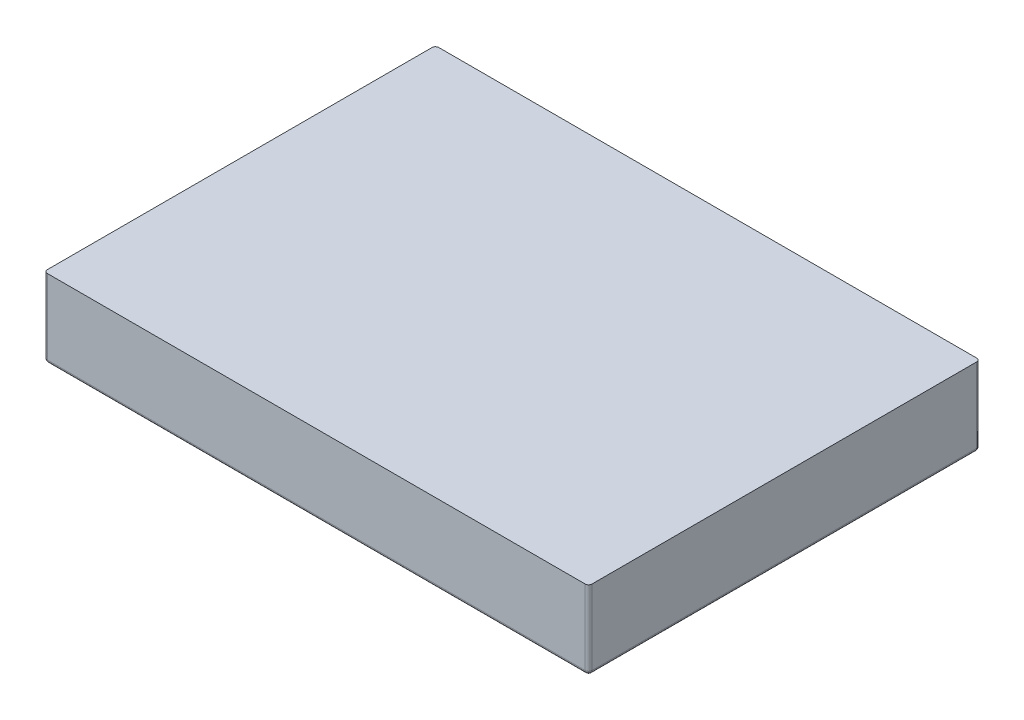
ISO-10303-21;
HEADER;
FILE_DESCRIPTION(('STEP AP214'),'2;1');
FILE_NAME('part.step','',(''),(''),'','','');
FILE_SCHEMA(('AUTOMOTIVE_DESIGN { 1 0 10303 214 1 1 1 1 }'));
ENDSEC;
DATA;
#1=APPLICATION_CONTEXT('core data for automotive mechanical design processes');
#2=APPLICATION_PROTOCOL_DEFINITION('international standard','automotive_design',2000,#1);
#3=PRODUCT_CONTEXT('',#1,'mechanical');
#4=PRODUCT('Part','Part','',(#3));
#5=PRODUCT_RELATED_PRODUCT_CATEGORY('part','',(#4));
#6=PRODUCT_DEFINITION_FORMATION('','',#4);
#7=PRODUCT_DEFINITION_CONTEXT('part definition',#1,'design');
#8=PRODUCT_DEFINITION('design','',#6,#7);
#9=PRODUCT_DEFINITION_SHAPE('','',#8);
#10=(LENGTH_UNIT() NAMED_UNIT(*) SI_UNIT(.MILLI.,.METRE.));
#11=(NAMED_UNIT(*) PLANE_ANGLE_UNIT() SI_UNIT($,.RADIAN.));
#12=(NAMED_UNIT(*) SI_UNIT($,.STERADIAN.) SOLID_ANGLE_UNIT());
#13=UNCERTAINTY_MEASURE_WITH_UNIT(LENGTH_MEASURE(1.E-05),#10,'distance_accuracy_value','');
#14=(GEOMETRIC_REPRESENTATION_CONTEXT(3) GLOBAL_UNCERTAINTY_ASSIGNED_CONTEXT((#13)) GLOBAL_UNIT_ASSIGNED_CONTEXT((#10,
#11,#12)) REPRESENTATION_CONTEXT('',''));
#15=CARTESIAN_POINT('',(0.,0.,0.));
#16=DIRECTION('',(0.,0.,1.));
#17=DIRECTION('',(1.,0.,0.));
#18=AXIS2_PLACEMENT_3D('',#15,#16,#17);
#19=CARTESIAN_POINT('',(-1.6,-0.46,-1.15));
#20=DIRECTION('',(0.,-1.,0.));
#21=DIRECTION('',(0.,0.,-1.));
#22=AXIS2_PLACEMENT_3D('',#19,#20,#21);
#23=PLANE('',#22);
#24=DIRECTION('',(0.,0.,1.));
#25=VECTOR('',#24,1.);
#26=CARTESIAN_POINT('',(1.58,-0.46,-1.15));
#27=LINE('',#26,#25);
#28=CARTESIAN_POINT('',(1.58,-0.46,1.13));
#29=VERTEX_POINT('',#28);
#30=CARTESIAN_POINT('',(1.58,-0.46,-1.13000000000014));
#31=VERTEX_POINT('',#30);
#32=EDGE_CURVE('E106',#29,#31,#27,.F.);
#33=ORIENTED_EDGE('',*,*,#32,.F.);
#34=DIRECTION('',(-1.,0.,0.));
#35=VECTOR('',#34,1.);
#36=CARTESIAN_POINT('',(-1.6,-0.46,1.13));
#37=LINE('',#36,#35);
#38=CARTESIAN_POINT('',(-1.58,-0.46,1.1300000000001));
#39=VERTEX_POINT('',#38);
#40=EDGE_CURVE('E101',#39,#29,#37,.F.);
#41=ORIENTED_EDGE('',*,*,#40,.F.);
#42=DIRECTION('',(0.,0.,-1.));
#43=VECTOR('',#42,1.);
#44=CARTESIAN_POINT('',(-1.58,-0.46,-1.15));
#45=LINE('',#44,#43);
#46=CARTESIAN_POINT('',(-1.58,-0.46,-1.13));
#47=VERTEX_POINT('',#46);
#48=EDGE_CURVE('E104',#47,#39,#45,.F.);
#49=ORIENTED_EDGE('',*,*,#48,.F.);
#50=DIRECTION('',(1.,0.,0.));
#51=VECTOR('',#50,1.);
#52=CARTESIAN_POINT('',(-1.6,-0.46,-1.13));
#53=LINE('',#52,#51);
#54=EDGE_CURVE('E168',#31,#47,#53,.F.);
#55=ORIENTED_EDGE('',*,*,#54,.F.);
#56=EDGE_LOOP('',(#33,#41,#49,#55));
#57=FACE_BOUND('',#56,.T.);
#58=ADVANCED_FACE('F17',(#57),#23,.T.);
#59=CARTESIAN_POINT('',(1.58,-0.44,1.13));
#60=DIRECTION('',(1.,0.,0.));
#61=DIRECTION('',(0.,1.,0.));
#62=AXIS2_PLACEMENT_3D('',#59,#60,#61);
#63=SPHERICAL_SURFACE('',#62,0.02);
#64=CARTESIAN_POINT('',(1.58,-0.44,1.13));
#65=DIRECTION('',(-1.,0.,0.));
#66=DIRECTION('',(0.,0.,1.));
#67=AXIS2_PLACEMENT_3D('',#64,#65,#66);
#68=CIRCLE('',#67,0.02);
#69=CARTESIAN_POINT('',(1.58,-0.44,1.15));
#70=VERTEX_POINT('',#69);
#71=EDGE_CURVE('E109',#29,#70,#68,.T.);
#72=ORIENTED_EDGE('',*,*,#71,.F.);
#73=CARTESIAN_POINT('',(1.58,-0.44,1.13));
#74=DIRECTION('',(0.,0.,1.));
#75=DIRECTION('',(1.,0.,0.));
#76=AXIS2_PLACEMENT_3D('',#73,#74,#75);
#77=CIRCLE('',#76,0.02);
#78=CARTESIAN_POINT('',(1.6,-0.44,1.13));
#79=VERTEX_POINT('',#78);
#80=EDGE_CURVE('E165',#79,#29,#77,.F.);
#81=ORIENTED_EDGE('',*,*,#80,.F.);
#82=CARTESIAN_POINT('',(1.58,-0.44,1.13));
#83=DIRECTION('',(0.,-1.,0.));
#84=DIRECTION('',(0.,0.,-1.));
#85=AXIS2_PLACEMENT_3D('',#82,#83,#84);
#86=CIRCLE('',#85,0.02);
#87=EDGE_CURVE('E231',#70,#79,#86,.F.);
#88=ORIENTED_EDGE('',*,*,#87,.F.);
#89=EDGE_LOOP('',(#72,#81,#88));
#90=FACE_BOUND('',#89,.T.);
#91=ADVANCED_FACE('F155',(#90),#63,.T.);
#92=CARTESIAN_POINT('',(-1.6,-0.44,1.13));
#93=DIRECTION('',(-1.,0.,0.));
#94=DIRECTION('',(0.,0.,1.));
#95=AXIS2_PLACEMENT_3D('',#92,#93,#94);
#96=CYLINDRICAL_SURFACE('',#95,0.02);
#97=ORIENTED_EDGE('',*,*,#71,.T.);
#98=DIRECTION('',(-1.,0.,0.));
#99=VECTOR('',#98,1.);
#100=CARTESIAN_POINT('',(1.6,-0.44,1.15));
#101=LINE('',#100,#99);
#102=CARTESIAN_POINT('',(-1.58,-0.44,1.15));
#103=VERTEX_POINT('',#102);
#104=EDGE_CURVE('E115',#70,#103,#101,.T.);
#105=ORIENTED_EDGE('',*,*,#104,.T.);
#106=CARTESIAN_POINT('',(-1.58,-0.44,1.13));
#107=DIRECTION('',(1.,0.,0.));
#108=DIRECTION('',(0.,1.,0.));
#109=AXIS2_PLACEMENT_3D('',#106,#107,#108);
#110=CIRCLE('',#109,0.02);
#111=EDGE_CURVE('E112',#39,#103,#110,.F.);
#112=ORIENTED_EDGE('',*,*,#111,.F.);
#113=ORIENTED_EDGE('',*,*,#40,.T.);
#114=EDGE_LOOP('',(#97,#105,#112,#113));
#115=FACE_BOUND('',#114,.T.);
#116=ADVANCED_FACE('F113',(#115),#96,.T.);
#117=CARTESIAN_POINT('',(-1.58,-0.44,1.13));
#118=DIRECTION('',(1.,0.,0.));
#119=DIRECTION('',(0.,1.,0.));
#120=AXIS2_PLACEMENT_3D('',#117,#118,#119);
#121=SPHERICAL_SURFACE('',#120,0.02);
#122=CARTESIAN_POINT('',(-1.58,-0.44,1.13));
#123=DIRECTION('',(0.,-1.,0.));
#124=DIRECTION('',(0.,0.,-1.));
#125=AXIS2_PLACEMENT_3D('',#122,#123,#124);
#126=CIRCLE('',#125,0.02);
#127=CARTESIAN_POINT('',(-1.6,-0.44,1.13));
#128=VERTEX_POINT('',#127);
#129=EDGE_CURVE('E130',#128,#103,#126,.F.);
#130=ORIENTED_EDGE('',*,*,#129,.F.);
#131=CARTESIAN_POINT('',(-1.58,-0.44,1.13));
#132=DIRECTION('',(0.,0.,-1.));
#133=DIRECTION('',(-1.,0.,0.));
#134=AXIS2_PLACEMENT_3D('',#131,#132,#133);
#135=CIRCLE('',#134,0.02);
#136=EDGE_CURVE('E121',#39,#128,#135,.T.);
#137=ORIENTED_EDGE('',*,*,#136,.F.);
#138=ORIENTED_EDGE('',*,*,#111,.T.);
#139=EDGE_LOOP('',(#130,#137,#138));
#140=FACE_BOUND('',#139,.T.);
#141=ADVANCED_FACE('F129',(#140),#121,.T.);
#142=CARTESIAN_POINT('',(-1.58,-0.44,-1.15));
#143=DIRECTION('',(0.,0.,-1.));
#144=DIRECTION('',(-1.,0.,0.));
#145=AXIS2_PLACEMENT_3D('',#142,#143,#144);
#146=CYLINDRICAL_SURFACE('',#145,0.02);
#147=CARTESIAN_POINT('',(-1.58,-0.44,-1.13));
#148=DIRECTION('',(0.,0.,-1.));
#149=DIRECTION('',(1.,0.,0.));
#150=AXIS2_PLACEMENT_3D('',#147,#148,#149);
#151=CIRCLE('',#150,0.02);
#152=CARTESIAN_POINT('',(-1.6,-0.44,-1.13));
#153=VERTEX_POINT('',#152);
#154=EDGE_CURVE('E126',#47,#153,#151,.T.);
#155=ORIENTED_EDGE('',*,*,#154,.F.);
#156=ORIENTED_EDGE('',*,*,#48,.T.);
#157=ORIENTED_EDGE('',*,*,#136,.T.);
#158=DIRECTION('',(0.,0.,-1.));
#159=VECTOR('',#158,1.);
#160=CARTESIAN_POINT('',(-1.6,-0.44,1.15));
#161=LINE('',#160,#159);
#162=EDGE_CURVE('E223',#128,#153,#161,.T.);
#163=ORIENTED_EDGE('',*,*,#162,.T.);
#164=EDGE_LOOP('',(#155,#156,#157,#163));
#165=FACE_BOUND('',#164,.T.);
#166=ADVANCED_FACE('F124',(#165),#146,.T.);
#167=CARTESIAN_POINT('',(-1.58,-0.44,-1.13));
#168=DIRECTION('',(1.,0.,0.));
#169=DIRECTION('',(0.,1.,0.));
#170=AXIS2_PLACEMENT_3D('',#167,#168,#169);
#171=SPHERICAL_SURFACE('',#170,0.02);
#172=CARTESIAN_POINT('',(-1.58,-0.44,-1.13));
#173=DIRECTION('',(0.,-1.,0.));
#174=DIRECTION('',(0.,0.,-1.));
#175=AXIS2_PLACEMENT_3D('',#172,#173,#174);
#176=CIRCLE('',#175,0.02);
#177=CARTESIAN_POINT('',(-1.58,-0.44,-1.15));
#178=VERTEX_POINT('',#177);
#179=EDGE_CURVE('E218',#178,#153,#176,.F.);
#180=ORIENTED_EDGE('',*,*,#179,.F.);
#181=CARTESIAN_POINT('',(-1.58,-0.44,-1.13));
#182=DIRECTION('',(1.,0.,0.));
#183=DIRECTION('',(0.,0.,-1.));
#184=AXIS2_PLACEMENT_3D('',#181,#182,#183);
#185=CIRCLE('',#184,0.02);
#186=EDGE_CURVE('E171',#47,#178,#185,.T.);
#187=ORIENTED_EDGE('',*,*,#186,.F.);
#188=ORIENTED_EDGE('',*,*,#154,.T.);
#189=EDGE_LOOP('',(#180,#187,#188));
#190=FACE_BOUND('',#189,.T.);
#191=ADVANCED_FACE('F267',(#190),#171,.T.);
#192=CARTESIAN_POINT('',(-1.6,-0.44,-1.13));
#193=DIRECTION('',(1.,0.,0.));
#194=DIRECTION('',(0.,0.,-1.));
#195=AXIS2_PLACEMENT_3D('',#192,#193,#194);
#196=CYLINDRICAL_SURFACE('',#195,0.02);
#197=CARTESIAN_POINT('',(1.58,-0.44,-1.13));
#198=DIRECTION('',(1.,0.,0.));
#199=DIRECTION('',(0.,1.,0.));
#200=AXIS2_PLACEMENT_3D('',#197,#198,#199);
#201=CIRCLE('',#200,0.02);
#202=CARTESIAN_POINT('',(1.58,-0.44,-1.15));
#203=VERTEX_POINT('',#202);
#204=EDGE_CURVE('E170',#31,#203,#201,.T.);
#205=ORIENTED_EDGE('',*,*,#204,.F.);
#206=ORIENTED_EDGE('',*,*,#54,.T.);
#207=ORIENTED_EDGE('',*,*,#186,.T.);
#208=DIRECTION('',(1.,0.,0.));
#209=VECTOR('',#208,1.);
#210=CARTESIAN_POINT('',(-1.6,-0.44,-1.15));
#211=LINE('',#210,#209);
#212=EDGE_CURVE('E213',#178,#203,#211,.T.);
#213=ORIENTED_EDGE('',*,*,#212,.T.);
#214=EDGE_LOOP('',(#205,#206,#207,#213));
#215=FACE_BOUND('',#214,.T.);
#216=ADVANCED_FACE('F263',(#215),#196,.T.);
#217=CARTESIAN_POINT('',(1.58,-0.44,-1.13));
#218=DIRECTION('',(1.,0.,0.));
#219=DIRECTION('',(0.,1.,0.));
#220=AXIS2_PLACEMENT_3D('',#217,#218,#219);
#221=SPHERICAL_SURFACE('',#220,0.02);
#222=ORIENTED_EDGE('',*,*,#204,.T.);
#223=CARTESIAN_POINT('',(1.58,-0.44,-1.13));
#224=DIRECTION('',(0.,-1.,0.));
#225=DIRECTION('',(0.,0.,-1.));
#226=AXIS2_PLACEMENT_3D('',#223,#224,#225);
#227=CIRCLE('',#226,0.02);
#228=CARTESIAN_POINT('',(1.6,-0.44,-1.13));
#229=VERTEX_POINT('',#228);
#230=EDGE_CURVE('E207',#229,#203,#227,.F.);
#231=ORIENTED_EDGE('',*,*,#230,.F.);
#232=CARTESIAN_POINT('',(1.58,-0.44,-1.13));
#233=DIRECTION('',(0.,0.,1.));
#234=DIRECTION('',(1.,0.,0.));
#235=AXIS2_PLACEMENT_3D('',#232,#233,#234);
#236=CIRCLE('',#235,0.02);
#237=EDGE_CURVE('E66',#31,#229,#236,.T.);
#238=ORIENTED_EDGE('',*,*,#237,.F.);
#239=EDGE_LOOP('',(#222,#231,#238));
#240=FACE_BOUND('',#239,.T.);
#241=ADVANCED_FACE('F258',(#240),#221,.T.);
#242=CARTESIAN_POINT('',(1.58,-0.44,-1.15));
#243=DIRECTION('',(0.,0.,1.));
#244=DIRECTION('',(1.,0.,0.));
#245=AXIS2_PLACEMENT_3D('',#242,#243,#244);
#246=CYLINDRICAL_SURFACE('',#245,0.02);
#247=ORIENTED_EDGE('',*,*,#237,.T.);
#248=DIRECTION('',(0.,0.,1.));
#249=VECTOR('',#248,1.);
#250=CARTESIAN_POINT('',(1.6,-0.44,-1.15));
#251=LINE('',#250,#249);
#252=EDGE_CURVE('E195',#229,#79,#251,.T.);
#253=ORIENTED_EDGE('',*,*,#252,.T.);
#254=ORIENTED_EDGE('',*,*,#80,.T.);
#255=ORIENTED_EDGE('',*,*,#32,.T.);
#256=EDGE_LOOP('',(#247,#253,#254,#255));
#257=FACE_BOUND('',#256,.T.);
#258=ADVANCED_FACE('F262',(#257),#246,.T.);
#259=CARTESIAN_POINT('',(1.58,-0.46,1.13));
#260=DIRECTION('',(0.,-1.,0.));
#261=DIRECTION('',(0.,0.,-1.));
#262=AXIS2_PLACEMENT_3D('',#259,#260,#261);
#263=CYLINDRICAL_SURFACE('',#262,0.02);
#264=ORIENTED_EDGE('',*,*,#87,.T.);
#265=DIRECTION('',(0.,1.,0.));
#266=VECTOR('',#265,1.);
#267=CARTESIAN_POINT('',(1.6,-0.46,1.13));
#268=LINE('',#267,#266);
#269=CARTESIAN_POINT('',(1.6,0.,1.13));
#270=VERTEX_POINT('',#269);
#271=EDGE_CURVE('E199',#79,#270,#268,.T.);
#272=ORIENTED_EDGE('',*,*,#271,.T.);
#273=CARTESIAN_POINT('',(1.58,0.,1.13));
#274=DIRECTION('',(0.,-1.,0.));
#275=DIRECTION('',(0.,0.,-1.));
#276=AXIS2_PLACEMENT_3D('',#273,#274,#275);
#277=CIRCLE('',#276,0.02);
#278=CARTESIAN_POINT('',(1.58,0.,1.15));
#279=VERTEX_POINT('',#278);
#280=EDGE_CURVE('E20',#270,#279,#277,.T.);
#281=ORIENTED_EDGE('',*,*,#280,.T.);
#282=DIRECTION('',(0.,1.,0.));
#283=VECTOR('',#282,1.);
#284=CARTESIAN_POINT('',(1.58,-0.46,1.15));
#285=LINE('',#284,#283);
#286=EDGE_CURVE('E144',#279,#70,#285,.F.);
#287=ORIENTED_EDGE('',*,*,#286,.T.);
#288=EDGE_LOOP('',(#264,#272,#281,#287));
#289=FACE_BOUND('',#288,.T.);
#290=ADVANCED_FACE('F374',(#289),#263,.T.);
#291=CARTESIAN_POINT('',(1.6,-0.46,1.15));
#292=DIRECTION('',(0.,0.,-1.));
#293=DIRECTION('',(-1.,0.,0.));
#294=AXIS2_PLACEMENT_3D('',#291,#292,#293);
#295=PLANE('',#294);
#296=ORIENTED_EDGE('',*,*,#286,.F.);
#297=DIRECTION('',(1.,0.,0.));
#298=VECTOR('',#297,1.);
#299=CARTESIAN_POINT('',(-1.6,0.,1.15));
#300=LINE('',#299,#298);
#301=CARTESIAN_POINT('',(-1.58,0.,1.15));
#302=VERTEX_POINT('',#301);
#303=EDGE_CURVE('E186',#279,#302,#300,.F.);
#304=ORIENTED_EDGE('',*,*,#303,.T.);
#305=DIRECTION('',(0.,-1.,0.));
#306=VECTOR('',#305,1.);
#307=CARTESIAN_POINT('',(-1.58,-0.46,1.15));
#308=LINE('',#307,#306);
#309=EDGE_CURVE('E140',#103,#302,#308,.F.);
#310=ORIENTED_EDGE('',*,*,#309,.F.);
#311=ORIENTED_EDGE('',*,*,#104,.F.);
#312=EDGE_LOOP('',(#296,#304,#310,#311));
#313=FACE_BOUND('',#312,.T.);
#314=ADVANCED_FACE('F365',(#313),#295,.F.);
#315=CARTESIAN_POINT('',(-1.58,-0.46,1.13));
#316=DIRECTION('',(0.,-1.,0.));
#317=DIRECTION('',(0.,0.,-1.));
#318=AXIS2_PLACEMENT_3D('',#315,#316,#317);
#319=CYLINDRICAL_SURFACE('',#318,0.02);
#320=CARTESIAN_POINT('',(-1.58,0.,1.13));
#321=DIRECTION('',(0.,-1.,0.));
#322=DIRECTION('',(0.,0.,-1.));
#323=AXIS2_PLACEMENT_3D('',#320,#321,#322);
#324=CIRCLE('',#323,0.02);
#325=CARTESIAN_POINT('',(-1.6,0.,1.13));
#326=VERTEX_POINT('',#325);
#327=EDGE_CURVE('E184',#302,#326,#324,.T.);
#328=ORIENTED_EDGE('',*,*,#327,.T.);
#329=DIRECTION('',(0.,1.,0.));
#330=VECTOR('',#329,1.);
#331=CARTESIAN_POINT('',(-1.6,-0.46,1.13));
#332=LINE('',#331,#330);
#333=EDGE_CURVE('E221',#326,#128,#332,.F.);
#334=ORIENTED_EDGE('',*,*,#333,.T.);
#335=ORIENTED_EDGE('',*,*,#129,.T.);
#336=ORIENTED_EDGE('',*,*,#309,.T.);
#337=EDGE_LOOP('',(#328,#334,#335,#336));
#338=FACE_BOUND('',#337,.T.);
#339=ADVANCED_FACE('F356',(#338),#319,.T.);
#340=CARTESIAN_POINT('',(-1.6,-0.46,1.15));
#341=DIRECTION('',(1.,0.,0.));
#342=DIRECTION('',(0.,0.,-1.));
#343=AXIS2_PLACEMENT_3D('',#340,#341,#342);
#344=PLANE('',#343);
#345=DIRECTION('',(0.,-1.,0.));
#346=VECTOR('',#345,1.);
#347=CARTESIAN_POINT('',(-1.6,-0.46,-1.13));
#348=LINE('',#347,#346);
#349=CARTESIAN_POINT('',(-1.6,0.,-1.13));
#350=VERTEX_POINT('',#349);
#351=EDGE_CURVE('E214',#153,#350,#348,.F.);
#352=ORIENTED_EDGE('',*,*,#351,.F.);
#353=ORIENTED_EDGE('',*,*,#162,.F.);
#354=ORIENTED_EDGE('',*,*,#333,.F.);
#355=DIRECTION('',(0.,0.,-1.));
#356=VECTOR('',#355,1.);
#357=CARTESIAN_POINT('',(-1.6,0.,-1.15));
#358=LINE('',#357,#356);
#359=EDGE_CURVE('E183',#326,#350,#358,.T.);
#360=ORIENTED_EDGE('',*,*,#359,.T.);
#361=EDGE_LOOP('',(#352,#353,#354,#360));
#362=FACE_BOUND('',#361,.T.);
#363=ADVANCED_FACE('F288',(#362),#344,.F.);
#364=CARTESIAN_POINT('',(-1.58,-0.46,-1.13));
#365=DIRECTION('',(0.,-1.,0.));
#366=DIRECTION('',(0.,0.,-1.));
#367=AXIS2_PLACEMENT_3D('',#364,#365,#366);
#368=CYLINDRICAL_SURFACE('',#367,0.02);
#369=ORIENTED_EDGE('',*,*,#179,.T.);
#370=ORIENTED_EDGE('',*,*,#351,.T.);
#371=CARTESIAN_POINT('',(-1.58,0.,-1.13));
#372=DIRECTION('',(0.,-1.,0.));
#373=DIRECTION('',(0.,0.,-1.));
#374=AXIS2_PLACEMENT_3D('',#371,#372,#373);
#375=CIRCLE('',#374,0.02);
#376=CARTESIAN_POINT('',(-1.58,0.,-1.15));
#377=VERTEX_POINT('',#376);
#378=EDGE_CURVE('E181',#350,#377,#375,.T.);
#379=ORIENTED_EDGE('',*,*,#378,.T.);
#380=DIRECTION('',(0.,1.,0.));
#381=VECTOR('',#380,1.);
#382=CARTESIAN_POINT('',(-1.58,-0.46,-1.15));
#383=LINE('',#382,#381);
#384=EDGE_CURVE('E210',#377,#178,#383,.F.);
#385=ORIENTED_EDGE('',*,*,#384,.T.);
#386=EDGE_LOOP('',(#369,#370,#379,#385));
#387=FACE_BOUND('',#386,.T.);
#388=ADVANCED_FACE('F292',(#387),#368,.T.);
#389=CARTESIAN_POINT('',(-1.6,-0.46,-1.15));
#390=DIRECTION('',(0.,0.,1.));
#391=DIRECTION('',(1.,0.,0.));
#392=AXIS2_PLACEMENT_3D('',#389,#390,#391);
#393=PLANE('',#392);
#394=DIRECTION('',(0.,-1.,0.));
#395=VECTOR('',#394,1.);
#396=CARTESIAN_POINT('',(1.58,-0.46,-1.15));
#397=LINE('',#396,#395);
#398=CARTESIAN_POINT('',(1.58,0.,-1.15));
#399=VERTEX_POINT('',#398);
#400=EDGE_CURVE('E203',#203,#399,#397,.F.);
#401=ORIENTED_EDGE('',*,*,#400,.F.);
#402=ORIENTED_EDGE('',*,*,#212,.F.);
#403=ORIENTED_EDGE('',*,*,#384,.F.);
#404=DIRECTION('',(1.,0.,0.));
#405=VECTOR('',#404,1.);
#406=CARTESIAN_POINT('',(-1.6,0.,-1.15));
#407=LINE('',#406,#405);
#408=EDGE_CURVE('E180',#377,#399,#407,.T.);
#409=ORIENTED_EDGE('',*,*,#408,.T.);
#410=EDGE_LOOP('',(#401,#402,#403,#409));
#411=FACE_BOUND('',#410,.T.);
#412=ADVANCED_FACE('F299',(#411),#393,.F.);
#413=CARTESIAN_POINT('',(1.58,-0.46,-1.13));
#414=DIRECTION('',(0.,-1.,0.));
#415=DIRECTION('',(0.,0.,-1.));
#416=AXIS2_PLACEMENT_3D('',#413,#414,#415);
#417=CYLINDRICAL_SURFACE('',#416,0.02);
#418=CARTESIAN_POINT('',(1.58,0.,-1.13));
#419=DIRECTION('',(0.,-1.,0.));
#420=DIRECTION('',(0.,0.,-1.));
#421=AXIS2_PLACEMENT_3D('',#418,#419,#420);
#422=CIRCLE('',#421,0.02);
#423=CARTESIAN_POINT('',(1.6,0.,-1.13));
#424=VERTEX_POINT('',#423);
#425=EDGE_CURVE('E26',#399,#424,#422,.T.);
#426=ORIENTED_EDGE('',*,*,#425,.T.);
#427=DIRECTION('',(0.,1.,0.));
#428=VECTOR('',#427,1.);
#429=CARTESIAN_POINT('',(1.6,-0.46,-1.13));
#430=LINE('',#429,#428);
#431=EDGE_CURVE('E34',#424,#229,#430,.F.);
#432=ORIENTED_EDGE('',*,*,#431,.T.);
#433=ORIENTED_EDGE('',*,*,#230,.T.);
#434=ORIENTED_EDGE('',*,*,#400,.T.);
#435=EDGE_LOOP('',(#426,#432,#433,#434));
#436=FACE_BOUND('',#435,.T.);
#437=ADVANCED_FACE('F306',(#436),#417,.T.);
#438=CARTESIAN_POINT('',(1.6,-0.46,-1.15));
#439=DIRECTION('',(-1.,0.,0.));
#440=DIRECTION('',(0.,0.,1.));
#441=AXIS2_PLACEMENT_3D('',#438,#439,#440);
#442=PLANE('',#441);
#443=ORIENTED_EDGE('',*,*,#431,.F.);
#444=DIRECTION('',(0.,0.,-1.));
#445=VECTOR('',#444,1.);
#446=CARTESIAN_POINT('',(1.6,0.,-1.15));
#447=LINE('',#446,#445);
#448=EDGE_CURVE('E11',#424,#270,#447,.F.);
#449=ORIENTED_EDGE('',*,*,#448,.T.);
#450=ORIENTED_EDGE('',*,*,#271,.F.);
#451=ORIENTED_EDGE('',*,*,#252,.F.);
#452=EDGE_LOOP('',(#443,#449,#450,#451));
#453=FACE_BOUND('',#452,.T.);
#454=ADVANCED_FACE('F304',(#453),#442,.F.);
#455=CARTESIAN_POINT('',(-1.6,0.,-1.15));
#456=DIRECTION('',(0.,-1.,0.));
#457=DIRECTION('',(0.,0.,-1.));
#458=AXIS2_PLACEMENT_3D('',#455,#456,#457);
#459=PLANE('',#458);
#460=ORIENTED_EDGE('',*,*,#425,.F.);
#461=ORIENTED_EDGE('',*,*,#408,.F.);
#462=ORIENTED_EDGE('',*,*,#378,.F.);
#463=ORIENTED_EDGE('',*,*,#359,.F.);
#464=ORIENTED_EDGE('',*,*,#327,.F.);
#465=ORIENTED_EDGE('',*,*,#303,.F.);
#466=ORIENTED_EDGE('',*,*,#280,.F.);
#467=ORIENTED_EDGE('',*,*,#448,.F.);
#468=EDGE_LOOP('',(#460,#461,#462,#463,#464,#465,#466,#467));
#469=FACE_BOUND('',#468,.T.);
#470=ADVANCED_FACE('F295',(#469),#459,.F.);
#471=CLOSED_SHELL('',(#58,#91,#116,#141,#166,#191,#216,#241,#258,#290,#314,#339,#363,#388,#412,
#437,#454,#470));
#472=MANIFOLD_SOLID_BREP('B1',#471);
#473=ADVANCED_BREP_SHAPE_REPRESENTATION('',(#18,#472),#14);
#474=SHAPE_DEFINITION_REPRESENTATION(#9,#473);
ENDSEC;
END-ISO-10303-21;
